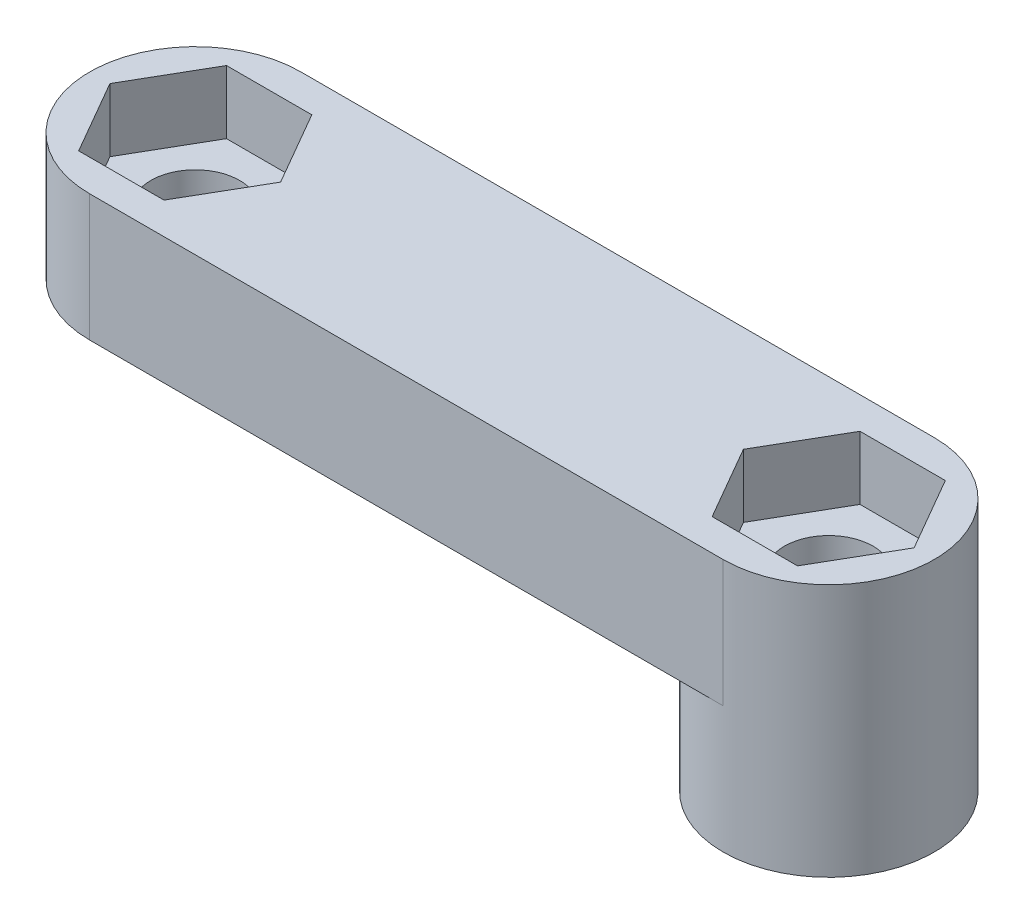
ISO-10303-21;
HEADER;
FILE_DESCRIPTION(('STEP AP214'),'2;1');
FILE_NAME('part.step','',(''),(''),'','','');
FILE_SCHEMA(('AUTOMOTIVE_DESIGN { 1 0 10303 214 1 1 1 1 }'));
ENDSEC;
DATA;
#1=APPLICATION_CONTEXT('core data for automotive mechanical design processes');
#2=APPLICATION_PROTOCOL_DEFINITION('international standard','automotive_design',2000,#1);
#3=PRODUCT_CONTEXT('',#1,'mechanical');
#4=PRODUCT('Part','Part','',(#3));
#5=PRODUCT_RELATED_PRODUCT_CATEGORY('part','',(#4));
#6=PRODUCT_DEFINITION_FORMATION('','',#4);
#7=PRODUCT_DEFINITION_CONTEXT('part definition',#1,'design');
#8=PRODUCT_DEFINITION('design','',#6,#7);
#9=PRODUCT_DEFINITION_SHAPE('','',#8);
#10=(LENGTH_UNIT() NAMED_UNIT(*) SI_UNIT(.MILLI.,.METRE.));
#11=(NAMED_UNIT(*) PLANE_ANGLE_UNIT() SI_UNIT($,.RADIAN.));
#12=(NAMED_UNIT(*) SI_UNIT($,.STERADIAN.) SOLID_ANGLE_UNIT());
#13=UNCERTAINTY_MEASURE_WITH_UNIT(LENGTH_MEASURE(1.E-05),#10,'distance_accuracy_value','');
#14=(GEOMETRIC_REPRESENTATION_CONTEXT(3) GLOBAL_UNCERTAINTY_ASSIGNED_CONTEXT((#13)) GLOBAL_UNIT_ASSIGNED_CONTEXT((#10,
#11,#12)) REPRESENTATION_CONTEXT('',''));
#15=CARTESIAN_POINT('',(0.,0.,0.));
#16=DIRECTION('',(0.,0.,1.));
#17=DIRECTION('',(1.,0.,0.));
#18=AXIS2_PLACEMENT_3D('',#15,#16,#17);
#19=CARTESIAN_POINT('',(15.,3.,0.));
#20=DIRECTION('',(0.,-1.,0.));
#21=DIRECTION('',(0.,0.,-1.));
#22=AXIS2_PLACEMENT_3D('',#19,#20,#21);
#23=CYLINDRICAL_SURFACE('',#22,2.1);
#24=CARTESIAN_POINT('',(15.,0.,0.));
#25=DIRECTION('',(0.,1.,0.));
#26=DIRECTION('',(0.,0.,1.));
#27=AXIS2_PLACEMENT_3D('',#24,#25,#26);
#28=CIRCLE('',#27,2.1);
#29=CARTESIAN_POINT('',(15.,0.,2.09999999999999));
#30=VERTEX_POINT('',#29);
#31=EDGE_CURVE('E47',#30,#30,#28,.T.);
#32=ORIENTED_EDGE('',*,*,#31,.T.);
#33=EDGE_LOOP('',(#32));
#34=FACE_BOUND('',#33,.T.);
#35=CARTESIAN_POINT('',(15.,-9.,0.));
#36=DIRECTION('',(0.,-1.,0.));
#37=DIRECTION('',(0.,0.,-1.));
#38=AXIS2_PLACEMENT_3D('',#35,#36,#37);
#39=CIRCLE('',#38,2.1);
#40=CARTESIAN_POINT('',(15.,-9.,-2.1));
#41=VERTEX_POINT('',#40);
#42=EDGE_CURVE('E473',#41,#41,#39,.T.);
#43=ORIENTED_EDGE('',*,*,#42,.T.);
#44=EDGE_LOOP('',(#43));
#45=FACE_BOUND('',#44,.T.);
#46=ADVANCED_FACE('F43',(#34,#45),#23,.F.);
#47=CARTESIAN_POINT('',(-15.,3.,0.));
#48=DIRECTION('',(0.,-1.,0.));
#49=DIRECTION('',(0.,0.,-1.));
#50=AXIS2_PLACEMENT_3D('',#47,#48,#49);
#51=CYLINDRICAL_SURFACE('',#50,2.1);
#52=CARTESIAN_POINT('',(-15.,-3.,0.));
#53=DIRECTION('',(0.,1.,0.));
#54=DIRECTION('',(0.,0.,1.));
#55=AXIS2_PLACEMENT_3D('',#52,#53,#54);
#56=CIRCLE('',#55,2.1);
#57=CARTESIAN_POINT('',(-15.,-3.,2.1));
#58=VERTEX_POINT('',#57);
#59=EDGE_CURVE('E204',#58,#58,#56,.T.);
#60=ORIENTED_EDGE('',*,*,#59,.F.);
#61=EDGE_LOOP('',(#60));
#62=FACE_BOUND('',#61,.T.);
#63=CARTESIAN_POINT('',(-15.,0.,0.));
#64=DIRECTION('',(0.,1.,0.));
#65=DIRECTION('',(0.,0.,1.));
#66=AXIS2_PLACEMENT_3D('',#63,#64,#65);
#67=CIRCLE('',#66,2.1);
#68=CARTESIAN_POINT('',(-15.,0.,2.1));
#69=VERTEX_POINT('',#68);
#70=EDGE_CURVE('E195',#69,#69,#67,.T.);
#71=ORIENTED_EDGE('',*,*,#70,.T.);
#72=EDGE_LOOP('',(#71));
#73=FACE_BOUND('',#72,.T.);
#74=ADVANCED_FACE('F323',(#62,#73),#51,.F.);
#75=CARTESIAN_POINT('',(-15.,3.,0.));
#76=DIRECTION('',(0.,1.,0.));
#77=DIRECTION('',(0.,0.,1.));
#78=AXIS2_PLACEMENT_3D('',#75,#76,#77);
#79=PLANE('',#78);
#80=DIRECTION('',(0.5,0.,-0.866025403784439));
#81=VECTOR('',#80,1.);
#82=CARTESIAN_POINT('',(-12.9792740578363,3.,3.5));
#83=LINE('',#82,#81);
#84=CARTESIAN_POINT('',(-12.9792740578363,3.,3.5));
#85=VERTEX_POINT('',#84);
#86=CARTESIAN_POINT('',(-10.9585481156726,3.,0.));
#87=VERTEX_POINT('',#86);
#88=EDGE_CURVE('E61',#85,#87,#83,.T.);
#89=ORIENTED_EDGE('',*,*,#88,.F.);
#90=DIRECTION('',(1.,0.,0.));
#91=VECTOR('',#90,1.);
#92=CARTESIAN_POINT('',(-17.0207259421637,3.,3.5));
#93=LINE('',#92,#91);
#94=CARTESIAN_POINT('',(-17.0207259421637,3.,3.5));
#95=VERTEX_POINT('',#94);
#96=EDGE_CURVE('E213',#95,#85,#93,.T.);
#97=ORIENTED_EDGE('',*,*,#96,.F.);
#98=DIRECTION('',(0.500000000000001,0.,0.866025403784438));
#99=VECTOR('',#98,1.);
#100=CARTESIAN_POINT('',(-19.0414518843274,3.,0.));
#101=LINE('',#100,#99);
#102=CARTESIAN_POINT('',(-19.0414518843274,3.,0.));
#103=VERTEX_POINT('',#102);
#104=EDGE_CURVE('E439',#103,#95,#101,.T.);
#105=ORIENTED_EDGE('',*,*,#104,.F.);
#106=DIRECTION('',(-0.5,0.,0.866025403784439));
#107=VECTOR('',#106,1.);
#108=CARTESIAN_POINT('',(-17.0207259421637,3.,-3.5));
#109=LINE('',#108,#107);
#110=CARTESIAN_POINT('',(-17.0207259421637,3.,-3.5));
#111=VERTEX_POINT('',#110);
#112=EDGE_CURVE('E432',#111,#103,#109,.T.);
#113=ORIENTED_EDGE('',*,*,#112,.F.);
#114=DIRECTION('',(-1.,0.,0.));
#115=VECTOR('',#114,1.);
#116=CARTESIAN_POINT('',(-12.9792740578363,3.,-3.5));
#117=LINE('',#116,#115);
#118=CARTESIAN_POINT('',(-12.9792740578363,3.,-3.5));
#119=VERTEX_POINT('',#118);
#120=EDGE_CURVE('E425',#119,#111,#117,.T.);
#121=ORIENTED_EDGE('',*,*,#120,.F.);
#122=DIRECTION('',(-0.5,0.,-0.866025403784439));
#123=VECTOR('',#122,1.);
#124=CARTESIAN_POINT('',(-10.9585481156726,3.,0.));
#125=LINE('',#124,#123);
#126=EDGE_CURVE('E433',#87,#119,#125,.T.);
#127=ORIENTED_EDGE('',*,*,#126,.F.);
#128=EDGE_LOOP('',(#89,#97,#105,#113,#121,#127));
#129=FACE_BOUND('',#128,.T.);
#130=DIRECTION('',(-0.5,0.,0.866025403784439));
#131=VECTOR('',#130,1.);
#132=CARTESIAN_POINT('',(12.9792740578363,3.,-3.50000000000001));
#133=LINE('',#132,#131);
#134=CARTESIAN_POINT('',(12.9792740578363,3.,-3.50000000000001));
#135=VERTEX_POINT('',#134);
#136=CARTESIAN_POINT('',(10.9585481156726,3.,0.));
#137=VERTEX_POINT('',#136);
#138=EDGE_CURVE('E69',#135,#137,#133,.T.);
#139=ORIENTED_EDGE('',*,*,#138,.F.);
#140=DIRECTION('',(-1.,0.,0.));
#141=VECTOR('',#140,1.);
#142=CARTESIAN_POINT('',(17.0207259421637,3.,-3.5));
#143=LINE('',#142,#141);
#144=CARTESIAN_POINT('',(17.0207259421637,3.,-3.5));
#145=VERTEX_POINT('',#144);
#146=EDGE_CURVE('E248',#145,#135,#143,.T.);
#147=ORIENTED_EDGE('',*,*,#146,.F.);
#148=DIRECTION('',(-0.499999999999999,0.,-0.866025403784439));
#149=VECTOR('',#148,1.);
#150=CARTESIAN_POINT('',(19.0414518843274,3.,0.));
#151=LINE('',#150,#149);
#152=CARTESIAN_POINT('',(19.0414518843274,3.,0.));
#153=VERTEX_POINT('',#152);
#154=EDGE_CURVE('E252',#153,#145,#151,.T.);
#155=ORIENTED_EDGE('',*,*,#154,.F.);
#156=DIRECTION('',(0.5,0.,-0.866025403784439));
#157=VECTOR('',#156,1.);
#158=CARTESIAN_POINT('',(17.0207259421637,3.,3.5));
#159=LINE('',#158,#157);
#160=CARTESIAN_POINT('',(17.0207259421637,3.,3.5));
#161=VERTEX_POINT('',#160);
#162=EDGE_CURVE('E257',#161,#153,#159,.T.);
#163=ORIENTED_EDGE('',*,*,#162,.F.);
#164=DIRECTION('',(1.,0.,0.));
#165=VECTOR('',#164,1.);
#166=CARTESIAN_POINT('',(12.9792740578363,3.,3.5));
#167=LINE('',#166,#165);
#168=CARTESIAN_POINT('',(12.9792740578363,3.,3.5));
#169=VERTEX_POINT('',#168);
#170=EDGE_CURVE('E261',#169,#161,#167,.T.);
#171=ORIENTED_EDGE('',*,*,#170,.F.);
#172=DIRECTION('',(0.499999999999999,0.,0.866025403784439));
#173=VECTOR('',#172,1.);
#174=CARTESIAN_POINT('',(10.9585481156726,3.,0.));
#175=LINE('',#174,#173);
#176=EDGE_CURVE('E265',#137,#169,#175,.T.);
#177=ORIENTED_EDGE('',*,*,#176,.F.);
#178=EDGE_LOOP('',(#139,#147,#155,#163,#171,#177));
#179=FACE_BOUND('',#178,.T.);
#180=CARTESIAN_POINT('',(-15.,3.,0.));
#181=DIRECTION('',(0.,1.,0.));
#182=DIRECTION('',(0.,0.,1.));
#183=AXIS2_PLACEMENT_3D('',#180,#181,#182);
#184=CIRCLE('',#183,5.);
#185=CARTESIAN_POINT('',(-15.,3.,-5.));
#186=VERTEX_POINT('',#185);
#187=CARTESIAN_POINT('',(-15.,3.,5.));
#188=VERTEX_POINT('',#187);
#189=EDGE_CURVE('E169',#186,#188,#184,.T.);
#190=ORIENTED_EDGE('',*,*,#189,.T.);
#191=DIRECTION('',(1.,0.,0.));
#192=VECTOR('',#191,1.);
#193=CARTESIAN_POINT('',(-15.,3.,5.));
#194=LINE('',#193,#192);
#195=CARTESIAN_POINT('',(15.,3.,4.99999999999999));
#196=VERTEX_POINT('',#195);
#197=EDGE_CURVE('E299',#188,#196,#194,.T.);
#198=ORIENTED_EDGE('',*,*,#197,.T.);
#199=CARTESIAN_POINT('',(15.,3.,0.));
#200=DIRECTION('',(0.,1.,0.));
#201=DIRECTION('',(0.,0.,1.));
#202=AXIS2_PLACEMENT_3D('',#199,#200,#201);
#203=CIRCLE('',#202,5.);
#204=CARTESIAN_POINT('',(15.,3.,-5.00000000000001));
#205=VERTEX_POINT('',#204);
#206=EDGE_CURVE('E187',#196,#205,#203,.T.);
#207=ORIENTED_EDGE('',*,*,#206,.T.);
#208=DIRECTION('',(-1.,0.,0.));
#209=VECTOR('',#208,1.);
#210=CARTESIAN_POINT('',(-15.,3.,-5.));
#211=LINE('',#210,#209);
#212=EDGE_CURVE('E176',#205,#186,#211,.T.);
#213=ORIENTED_EDGE('',*,*,#212,.T.);
#214=EDGE_LOOP('',(#190,#198,#207,#213));
#215=FACE_BOUND('',#214,.T.);
#216=ADVANCED_FACE('F314',(#129,#179,#215),#79,.T.);
#217=CARTESIAN_POINT('',(-15.,-3.,0.));
#218=DIRECTION('',(0.,1.,0.));
#219=DIRECTION('',(0.,0.,1.));
#220=AXIS2_PLACEMENT_3D('',#217,#218,#219);
#221=PLANE('',#220);
#222=CARTESIAN_POINT('',(15.,-3.,0.));
#223=DIRECTION('',(0.,-1.,0.));
#224=DIRECTION('',(0.,0.,-1.));
#225=AXIS2_PLACEMENT_3D('',#222,#223,#224);
#226=CIRCLE('',#225,5.);
#227=CARTESIAN_POINT('',(15.,-3.,4.99999999999999));
#228=VERTEX_POINT('',#227);
#229=CARTESIAN_POINT('',(15.,-3.,-5.00000000000001));
#230=VERTEX_POINT('',#229);
#231=EDGE_CURVE('E11',#228,#230,#226,.T.);
#232=ORIENTED_EDGE('',*,*,#231,.F.);
#233=DIRECTION('',(1.,0.,0.));
#234=VECTOR('',#233,1.);
#235=CARTESIAN_POINT('',(-15.,-3.,5.));
#236=LINE('',#235,#234);
#237=CARTESIAN_POINT('',(-15.,-3.,5.));
#238=VERTEX_POINT('',#237);
#239=EDGE_CURVE('E170',#238,#228,#236,.T.);
#240=ORIENTED_EDGE('',*,*,#239,.F.);
#241=CARTESIAN_POINT('',(-15.,-3.,0.));
#242=DIRECTION('',(0.,1.,0.));
#243=DIRECTION('',(0.,0.,1.));
#244=AXIS2_PLACEMENT_3D('',#241,#242,#243);
#245=CIRCLE('',#244,5.);
#246=CARTESIAN_POINT('',(-15.,-3.,-5.));
#247=VERTEX_POINT('',#246);
#248=EDGE_CURVE('E164',#247,#238,#245,.T.);
#249=ORIENTED_EDGE('',*,*,#248,.F.);
#250=DIRECTION('',(-1.,0.,0.));
#251=VECTOR('',#250,1.);
#252=CARTESIAN_POINT('',(-15.,-3.,-5.));
#253=LINE('',#252,#251);
#254=EDGE_CURVE('E158',#230,#247,#253,.T.);
#255=ORIENTED_EDGE('',*,*,#254,.F.);
#256=EDGE_LOOP('',(#232,#240,#249,#255));
#257=FACE_BOUND('',#256,.T.);
#258=ORIENTED_EDGE('',*,*,#59,.T.);
#259=EDGE_LOOP('',(#258));
#260=FACE_BOUND('',#259,.T.);
#261=ADVANCED_FACE('F160',(#257,#260),#221,.F.);
#262=CARTESIAN_POINT('',(-15.,3.,0.));
#263=DIRECTION('',(0.,-1.,0.));
#264=DIRECTION('',(0.,0.,-1.));
#265=AXIS2_PLACEMENT_3D('',#262,#263,#264);
#266=CYLINDRICAL_SURFACE('',#265,5.);
#267=ORIENTED_EDGE('',*,*,#248,.T.);
#268=DIRECTION('',(0.,-1.,0.));
#269=VECTOR('',#268,1.);
#270=CARTESIAN_POINT('',(-15.,3.,5.));
#271=LINE('',#270,#269);
#272=EDGE_CURVE('E53',#188,#238,#271,.T.);
#273=ORIENTED_EDGE('',*,*,#272,.F.);
#274=ORIENTED_EDGE('',*,*,#189,.F.);
#275=DIRECTION('',(0.,-1.,0.));
#276=VECTOR('',#275,1.);
#277=CARTESIAN_POINT('',(-15.,3.,-5.));
#278=LINE('',#277,#276);
#279=EDGE_CURVE('E181',#186,#247,#278,.T.);
#280=ORIENTED_EDGE('',*,*,#279,.T.);
#281=EDGE_LOOP('',(#267,#273,#274,#280));
#282=FACE_BOUND('',#281,.T.);
#283=ADVANCED_FACE('F45',(#282),#266,.T.);
#284=CARTESIAN_POINT('',(-15.,3.,5.));
#285=DIRECTION('',(0.,0.,-1.));
#286=DIRECTION('',(-1.,0.,0.));
#287=AXIS2_PLACEMENT_3D('',#284,#285,#286);
#288=PLANE('',#287);
#289=ORIENTED_EDGE('',*,*,#239,.T.);
#290=DIRECTION('',(0.,-1.,0.));
#291=VECTOR('',#290,1.);
#292=CARTESIAN_POINT('',(15.,3.,4.99999999999999));
#293=LINE('',#292,#291);
#294=EDGE_CURVE('E180',#196,#228,#293,.T.);
#295=ORIENTED_EDGE('',*,*,#294,.F.);
#296=ORIENTED_EDGE('',*,*,#197,.F.);
#297=ORIENTED_EDGE('',*,*,#272,.T.);
#298=EDGE_LOOP('',(#289,#295,#296,#297));
#299=FACE_BOUND('',#298,.T.);
#300=ADVANCED_FACE('F315',(#299),#288,.F.);
#301=CARTESIAN_POINT('',(15.,3.,0.));
#302=DIRECTION('',(0.,-1.,0.));
#303=DIRECTION('',(0.,0.,-1.));
#304=AXIS2_PLACEMENT_3D('',#301,#302,#303);
#305=CYLINDRICAL_SURFACE('',#304,5.);
#306=ORIENTED_EDGE('',*,*,#294,.T.);
#307=ORIENTED_EDGE('',*,*,#231,.T.);
#308=DIRECTION('',(0.,-1.,0.));
#309=VECTOR('',#308,1.);
#310=CARTESIAN_POINT('',(15.,3.,-5.00000000000001));
#311=LINE('',#310,#309);
#312=EDGE_CURVE('E174',#205,#230,#311,.T.);
#313=ORIENTED_EDGE('',*,*,#312,.F.);
#314=ORIENTED_EDGE('',*,*,#206,.F.);
#315=EDGE_LOOP('',(#306,#307,#313,#314));
#316=FACE_BOUND('',#315,.T.);
#317=CARTESIAN_POINT('',(15.,-9.,0.));
#318=DIRECTION('',(0.,-1.,0.));
#319=DIRECTION('',(0.,0.,-1.));
#320=AXIS2_PLACEMENT_3D('',#317,#318,#319);
#321=CIRCLE('',#320,5.);
#322=CARTESIAN_POINT('',(15.,-9.,-5.00000000000001));
#323=VERTEX_POINT('',#322);
#324=EDGE_CURVE('E247',#323,#323,#321,.T.);
#325=ORIENTED_EDGE('',*,*,#324,.F.);
#326=EDGE_LOOP('',(#325));
#327=FACE_BOUND('',#326,.T.);
#328=ADVANCED_FACE('F184',(#316,#327),#305,.T.);
#329=CARTESIAN_POINT('',(-15.,3.,-5.));
#330=DIRECTION('',(0.,0.,1.));
#331=DIRECTION('',(1.,0.,0.));
#332=AXIS2_PLACEMENT_3D('',#329,#330,#331);
#333=PLANE('',#332);
#334=ORIENTED_EDGE('',*,*,#254,.T.);
#335=ORIENTED_EDGE('',*,*,#279,.F.);
#336=ORIENTED_EDGE('',*,*,#212,.F.);
#337=ORIENTED_EDGE('',*,*,#312,.T.);
#338=EDGE_LOOP('',(#334,#335,#336,#337));
#339=FACE_BOUND('',#338,.T.);
#340=ADVANCED_FACE('F175',(#339),#333,.F.);
#341=CARTESIAN_POINT('',(-12.9792740578363,0.,3.5));
#342=DIRECTION('',(0.866025403784439,0.,0.5));
#343=DIRECTION('',(0.5,0.,-0.866025403784439));
#344=AXIS2_PLACEMENT_3D('',#341,#342,#343);
#345=PLANE('',#344);
#346=ORIENTED_EDGE('',*,*,#88,.T.);
#347=DIRECTION('',(0.,1.,0.));
#348=VECTOR('',#347,1.);
#349=CARTESIAN_POINT('',(-10.9585481156726,0.,0.));
#350=LINE('',#349,#348);
#351=CARTESIAN_POINT('',(-10.9585481156726,0.,0.));
#352=VERTEX_POINT('',#351);
#353=EDGE_CURVE('E224',#352,#87,#350,.T.);
#354=ORIENTED_EDGE('',*,*,#353,.F.);
#355=DIRECTION('',(0.5,0.,-0.866025403784439));
#356=VECTOR('',#355,1.);
#357=CARTESIAN_POINT('',(-12.9792740578363,0.,3.5));
#358=LINE('',#357,#356);
#359=CARTESIAN_POINT('',(-12.9792740578363,0.,3.5));
#360=VERTEX_POINT('',#359);
#361=EDGE_CURVE('E467',#360,#352,#358,.T.);
#362=ORIENTED_EDGE('',*,*,#361,.F.);
#363=DIRECTION('',(0.,1.,0.));
#364=VECTOR('',#363,1.);
#365=CARTESIAN_POINT('',(-12.9792740578363,0.,3.5));
#366=LINE('',#365,#364);
#367=EDGE_CURVE('E198',#360,#85,#366,.T.);
#368=ORIENTED_EDGE('',*,*,#367,.T.);
#369=EDGE_LOOP('',(#346,#354,#362,#368));
#370=FACE_BOUND('',#369,.T.);
#371=ADVANCED_FACE('F340',(#370),#345,.F.);
#372=CARTESIAN_POINT('',(-17.0207259421637,0.,3.5));
#373=DIRECTION('',(0.,0.,1.));
#374=DIRECTION('',(1.,0.,0.));
#375=AXIS2_PLACEMENT_3D('',#372,#373,#374);
#376=PLANE('',#375);
#377=ORIENTED_EDGE('',*,*,#96,.T.);
#378=ORIENTED_EDGE('',*,*,#367,.F.);
#379=DIRECTION('',(1.,0.,0.));
#380=VECTOR('',#379,1.);
#381=CARTESIAN_POINT('',(-17.0207259421637,0.,3.5));
#382=LINE('',#381,#380);
#383=CARTESIAN_POINT('',(-17.0207259421637,0.,3.5));
#384=VERTEX_POINT('',#383);
#385=EDGE_CURVE('E227',#384,#360,#382,.T.);
#386=ORIENTED_EDGE('',*,*,#385,.F.);
#387=DIRECTION('',(0.,1.,0.));
#388=VECTOR('',#387,1.);
#389=CARTESIAN_POINT('',(-17.0207259421637,0.,3.5));
#390=LINE('',#389,#388);
#391=EDGE_CURVE('E205',#384,#95,#390,.T.);
#392=ORIENTED_EDGE('',*,*,#391,.T.);
#393=EDGE_LOOP('',(#377,#378,#386,#392));
#394=FACE_BOUND('',#393,.T.);
#395=ADVANCED_FACE('F344',(#394),#376,.F.);
#396=CARTESIAN_POINT('',(-19.0414518843274,0.,0.));
#397=DIRECTION('',(-0.866025403784438,0.,0.500000000000001));
#398=DIRECTION('',(0.500000000000001,0.,0.866025403784438));
#399=AXIS2_PLACEMENT_3D('',#396,#397,#398);
#400=PLANE('',#399);
#401=ORIENTED_EDGE('',*,*,#104,.T.);
#402=ORIENTED_EDGE('',*,*,#391,.F.);
#403=DIRECTION('',(0.500000000000001,0.,0.866025403784438));
#404=VECTOR('',#403,1.);
#405=CARTESIAN_POINT('',(-19.0414518843274,0.,0.));
#406=LINE('',#405,#404);
#407=CARTESIAN_POINT('',(-19.0414518843274,0.,0.));
#408=VERTEX_POINT('',#407);
#409=EDGE_CURVE('E451',#408,#384,#406,.T.);
#410=ORIENTED_EDGE('',*,*,#409,.F.);
#411=DIRECTION('',(0.,1.,0.));
#412=VECTOR('',#411,1.);
#413=CARTESIAN_POINT('',(-19.0414518843274,0.,0.));
#414=LINE('',#413,#412);
#415=EDGE_CURVE('E210',#408,#103,#414,.T.);
#416=ORIENTED_EDGE('',*,*,#415,.T.);
#417=EDGE_LOOP('',(#401,#402,#410,#416));
#418=FACE_BOUND('',#417,.T.);
#419=ADVANCED_FACE('F349',(#418),#400,.F.);
#420=CARTESIAN_POINT('',(-17.0207259421637,0.,-3.5));
#421=DIRECTION('',(-0.866025403784439,0.,-0.5));
#422=DIRECTION('',(-0.5,0.,0.866025403784439));
#423=AXIS2_PLACEMENT_3D('',#420,#421,#422);
#424=PLANE('',#423);
#425=ORIENTED_EDGE('',*,*,#112,.T.);
#426=ORIENTED_EDGE('',*,*,#415,.F.);
#427=DIRECTION('',(-0.5,0.,0.866025403784439));
#428=VECTOR('',#427,1.);
#429=CARTESIAN_POINT('',(-17.0207259421637,0.,-3.5));
#430=LINE('',#429,#428);
#431=CARTESIAN_POINT('',(-17.0207259421637,0.,-3.5));
#432=VERTEX_POINT('',#431);
#433=EDGE_CURVE('E455',#432,#408,#430,.T.);
#434=ORIENTED_EDGE('',*,*,#433,.F.);
#435=DIRECTION('',(0.,1.,0.));
#436=VECTOR('',#435,1.);
#437=CARTESIAN_POINT('',(-17.0207259421637,0.,-3.5));
#438=LINE('',#437,#436);
#439=EDGE_CURVE('E218',#432,#111,#438,.T.);
#440=ORIENTED_EDGE('',*,*,#439,.T.);
#441=EDGE_LOOP('',(#425,#426,#434,#440));
#442=FACE_BOUND('',#441,.T.);
#443=ADVANCED_FACE('F412',(#442),#424,.F.);
#444=CARTESIAN_POINT('',(-12.9792740578363,0.,-3.5));
#445=DIRECTION('',(0.,0.,-1.));
#446=DIRECTION('',(-1.,0.,0.));
#447=AXIS2_PLACEMENT_3D('',#444,#445,#446);
#448=PLANE('',#447);
#449=ORIENTED_EDGE('',*,*,#120,.T.);
#450=ORIENTED_EDGE('',*,*,#439,.F.);
#451=DIRECTION('',(-1.,0.,0.));
#452=VECTOR('',#451,1.);
#453=CARTESIAN_POINT('',(-12.9792740578363,0.,-3.5));
#454=LINE('',#453,#452);
#455=CARTESIAN_POINT('',(-12.9792740578363,0.,-3.5));
#456=VERTEX_POINT('',#455);
#457=EDGE_CURVE('E459',#456,#432,#454,.T.);
#458=ORIENTED_EDGE('',*,*,#457,.F.);
#459=DIRECTION('',(0.,1.,0.));
#460=VECTOR('',#459,1.);
#461=CARTESIAN_POINT('',(-12.9792740578363,0.,-3.5));
#462=LINE('',#461,#460);
#463=EDGE_CURVE('E221',#456,#119,#462,.T.);
#464=ORIENTED_EDGE('',*,*,#463,.T.);
#465=EDGE_LOOP('',(#449,#450,#458,#464));
#466=FACE_BOUND('',#465,.T.);
#467=ADVANCED_FACE('F415',(#466),#448,.F.);
#468=CARTESIAN_POINT('',(-10.9585481156726,0.,0.));
#469=DIRECTION('',(0.866025403784439,0.,-0.5));
#470=DIRECTION('',(-0.5,0.,-0.866025403784439));
#471=AXIS2_PLACEMENT_3D('',#468,#469,#470);
#472=PLANE('',#471);
#473=ORIENTED_EDGE('',*,*,#126,.T.);
#474=ORIENTED_EDGE('',*,*,#463,.F.);
#475=DIRECTION('',(-0.5,0.,-0.866025403784439));
#476=VECTOR('',#475,1.);
#477=CARTESIAN_POINT('',(-10.9585481156726,0.,0.));
#478=LINE('',#477,#476);
#479=EDGE_CURVE('E463',#352,#456,#478,.T.);
#480=ORIENTED_EDGE('',*,*,#479,.F.);
#481=ORIENTED_EDGE('',*,*,#353,.T.);
#482=EDGE_LOOP('',(#473,#474,#480,#481));
#483=FACE_BOUND('',#482,.T.);
#484=ADVANCED_FACE('F354',(#483),#472,.F.);
#485=CARTESIAN_POINT('',(0.,0.,0.));
#486=DIRECTION('',(0.,1.,0.));
#487=DIRECTION('',(0.,0.,1.));
#488=AXIS2_PLACEMENT_3D('',#485,#486,#487);
#489=PLANE('',#488);
#490=ORIENTED_EDGE('',*,*,#70,.F.);
#491=EDGE_LOOP('',(#490));
#492=FACE_BOUND('',#491,.T.);
#493=ORIENTED_EDGE('',*,*,#361,.T.);
#494=ORIENTED_EDGE('',*,*,#479,.T.);
#495=ORIENTED_EDGE('',*,*,#457,.T.);
#496=ORIENTED_EDGE('',*,*,#433,.T.);
#497=ORIENTED_EDGE('',*,*,#409,.T.);
#498=ORIENTED_EDGE('',*,*,#385,.T.);
#499=EDGE_LOOP('',(#493,#494,#495,#496,#497,#498));
#500=FACE_BOUND('',#499,.T.);
#501=ADVANCED_FACE('F360',(#492,#500),#489,.T.);
#502=CARTESIAN_POINT('',(12.9792740578363,0.,-3.50000000000001));
#503=DIRECTION('',(-0.866025403784439,0.,-0.5));
#504=DIRECTION('',(-0.5,0.,0.866025403784439));
#505=AXIS2_PLACEMENT_3D('',#502,#503,#504);
#506=PLANE('',#505);
#507=ORIENTED_EDGE('',*,*,#138,.T.);
#508=DIRECTION('',(0.,1.,0.));
#509=VECTOR('',#508,1.);
#510=CARTESIAN_POINT('',(10.9585481156726,0.,0.));
#511=LINE('',#510,#509);
#512=CARTESIAN_POINT('',(10.9585481156726,0.,0.));
#513=VERTEX_POINT('',#512);
#514=EDGE_CURVE('E228',#513,#137,#511,.T.);
#515=ORIENTED_EDGE('',*,*,#514,.F.);
#516=DIRECTION('',(-0.5,0.,0.866025403784439));
#517=VECTOR('',#516,1.);
#518=CARTESIAN_POINT('',(12.9792740578363,0.,-3.50000000000001));
#519=LINE('',#518,#517);
#520=CARTESIAN_POINT('',(12.9792740578363,0.,-3.50000000000001));
#521=VERTEX_POINT('',#520);
#522=EDGE_CURVE('E253',#521,#513,#519,.T.);
#523=ORIENTED_EDGE('',*,*,#522,.F.);
#524=DIRECTION('',(0.,1.,0.));
#525=VECTOR('',#524,1.);
#526=CARTESIAN_POINT('',(12.9792740578363,0.,-3.50000000000001));
#527=LINE('',#526,#525);
#528=EDGE_CURVE('E244',#521,#135,#527,.T.);
#529=ORIENTED_EDGE('',*,*,#528,.T.);
#530=EDGE_LOOP('',(#507,#515,#523,#529));
#531=FACE_BOUND('',#530,.T.);
#532=ADVANCED_FACE('F356',(#531),#506,.F.);
#533=CARTESIAN_POINT('',(17.0207259421637,0.,-3.5));
#534=DIRECTION('',(0.,0.,-1.));
#535=DIRECTION('',(-1.,0.,0.));
#536=AXIS2_PLACEMENT_3D('',#533,#534,#535);
#537=PLANE('',#536);
#538=ORIENTED_EDGE('',*,*,#146,.T.);
#539=ORIENTED_EDGE('',*,*,#528,.F.);
#540=DIRECTION('',(-1.,0.,0.));
#541=VECTOR('',#540,1.);
#542=CARTESIAN_POINT('',(17.0207259421637,0.,-3.5));
#543=LINE('',#542,#541);
#544=CARTESIAN_POINT('',(17.0207259421637,0.,-3.5));
#545=VERTEX_POINT('',#544);
#546=EDGE_CURVE('E231',#545,#521,#543,.T.);
#547=ORIENTED_EDGE('',*,*,#546,.F.);
#548=DIRECTION('',(0.,1.,0.));
#549=VECTOR('',#548,1.);
#550=CARTESIAN_POINT('',(17.0207259421637,0.,-3.5));
#551=LINE('',#550,#549);
#552=EDGE_CURVE('E241',#545,#145,#551,.T.);
#553=ORIENTED_EDGE('',*,*,#552,.T.);
#554=EDGE_LOOP('',(#538,#539,#547,#553));
#555=FACE_BOUND('',#554,.T.);
#556=ADVANCED_FACE('F359',(#555),#537,.F.);
#557=CARTESIAN_POINT('',(19.0414518843274,0.,0.));
#558=DIRECTION('',(0.866025403784439,0.,-0.499999999999999));
#559=DIRECTION('',(-0.499999999999999,0.,-0.866025403784439));
#560=AXIS2_PLACEMENT_3D('',#557,#558,#559);
#561=PLANE('',#560);
#562=ORIENTED_EDGE('',*,*,#154,.T.);
#563=ORIENTED_EDGE('',*,*,#552,.F.);
#564=DIRECTION('',(-0.499999999999999,0.,-0.866025403784439));
#565=VECTOR('',#564,1.);
#566=CARTESIAN_POINT('',(19.0414518843274,0.,0.));
#567=LINE('',#566,#565);
#568=CARTESIAN_POINT('',(19.0414518843274,0.,0.));
#569=VERTEX_POINT('',#568);
#570=EDGE_CURVE('E274',#569,#545,#567,.T.);
#571=ORIENTED_EDGE('',*,*,#570,.F.);
#572=DIRECTION('',(0.,1.,0.));
#573=VECTOR('',#572,1.);
#574=CARTESIAN_POINT('',(19.0414518843274,0.,0.));
#575=LINE('',#574,#573);
#576=EDGE_CURVE('E238',#569,#153,#575,.T.);
#577=ORIENTED_EDGE('',*,*,#576,.T.);
#578=EDGE_LOOP('',(#562,#563,#571,#577));
#579=FACE_BOUND('',#578,.T.);
#580=ADVANCED_FACE('F373',(#579),#561,.F.);
#581=CARTESIAN_POINT('',(17.0207259421637,0.,3.5));
#582=DIRECTION('',(0.866025403784438,0.,0.5));
#583=DIRECTION('',(0.5,0.,-0.866025403784439));
#584=AXIS2_PLACEMENT_3D('',#581,#582,#583);
#585=PLANE('',#584);
#586=ORIENTED_EDGE('',*,*,#162,.T.);
#587=ORIENTED_EDGE('',*,*,#576,.F.);
#588=DIRECTION('',(0.5,0.,-0.866025403784439));
#589=VECTOR('',#588,1.);
#590=CARTESIAN_POINT('',(17.0207259421637,0.,3.5));
#591=LINE('',#590,#589);
#592=CARTESIAN_POINT('',(17.0207259421637,0.,3.5));
#593=VERTEX_POINT('',#592);
#594=EDGE_CURVE('E278',#593,#569,#591,.T.);
#595=ORIENTED_EDGE('',*,*,#594,.F.);
#596=DIRECTION('',(0.,1.,0.));
#597=VECTOR('',#596,1.);
#598=CARTESIAN_POINT('',(17.0207259421637,0.,3.5));
#599=LINE('',#598,#597);
#600=EDGE_CURVE('E235',#593,#161,#599,.T.);
#601=ORIENTED_EDGE('',*,*,#600,.T.);
#602=EDGE_LOOP('',(#586,#587,#595,#601));
#603=FACE_BOUND('',#602,.T.);
#604=ADVANCED_FACE('F369',(#603),#585,.F.);
#605=CARTESIAN_POINT('',(12.9792740578363,0.,3.5));
#606=DIRECTION('',(0.,0.,1.));
#607=DIRECTION('',(1.,0.,0.));
#608=AXIS2_PLACEMENT_3D('',#605,#606,#607);
#609=PLANE('',#608);
#610=ORIENTED_EDGE('',*,*,#170,.T.);
#611=ORIENTED_EDGE('',*,*,#600,.F.);
#612=DIRECTION('',(1.,0.,0.));
#613=VECTOR('',#612,1.);
#614=CARTESIAN_POINT('',(12.9792740578363,0.,3.5));
#615=LINE('',#614,#613);
#616=CARTESIAN_POINT('',(12.9792740578363,0.,3.5));
#617=VERTEX_POINT('',#616);
#618=EDGE_CURVE('E282',#617,#593,#615,.T.);
#619=ORIENTED_EDGE('',*,*,#618,.F.);
#620=DIRECTION('',(0.,1.,0.));
#621=VECTOR('',#620,1.);
#622=CARTESIAN_POINT('',(12.9792740578363,0.,3.5));
#623=LINE('',#622,#621);
#624=EDGE_CURVE('E232',#617,#169,#623,.T.);
#625=ORIENTED_EDGE('',*,*,#624,.T.);
#626=EDGE_LOOP('',(#610,#611,#619,#625));
#627=FACE_BOUND('',#626,.T.);
#628=ADVANCED_FACE('F365',(#627),#609,.F.);
#629=CARTESIAN_POINT('',(10.9585481156726,0.,0.));
#630=DIRECTION('',(-0.866025403784439,0.,0.499999999999999));
#631=DIRECTION('',(0.499999999999999,0.,0.866025403784439));
#632=AXIS2_PLACEMENT_3D('',#629,#630,#631);
#633=PLANE('',#632);
#634=ORIENTED_EDGE('',*,*,#176,.T.);
#635=ORIENTED_EDGE('',*,*,#624,.F.);
#636=DIRECTION('',(0.499999999999999,0.,0.866025403784439));
#637=VECTOR('',#636,1.);
#638=CARTESIAN_POINT('',(10.9585481156726,0.,0.));
#639=LINE('',#638,#637);
#640=EDGE_CURVE('E286',#513,#617,#639,.T.);
#641=ORIENTED_EDGE('',*,*,#640,.F.);
#642=ORIENTED_EDGE('',*,*,#514,.T.);
#643=EDGE_LOOP('',(#634,#635,#641,#642));
#644=FACE_BOUND('',#643,.T.);
#645=ADVANCED_FACE('F361',(#644),#633,.F.);
#646=CARTESIAN_POINT('',(0.,0.,0.));
#647=DIRECTION('',(0.,1.,0.));
#648=DIRECTION('',(0.,0.,1.));
#649=AXIS2_PLACEMENT_3D('',#646,#647,#648);
#650=PLANE('',#649);
#651=ORIENTED_EDGE('',*,*,#31,.F.);
#652=EDGE_LOOP('',(#651));
#653=FACE_BOUND('',#652,.T.);
#654=ORIENTED_EDGE('',*,*,#522,.T.);
#655=ORIENTED_EDGE('',*,*,#640,.T.);
#656=ORIENTED_EDGE('',*,*,#618,.T.);
#657=ORIENTED_EDGE('',*,*,#594,.T.);
#658=ORIENTED_EDGE('',*,*,#570,.T.);
#659=ORIENTED_EDGE('',*,*,#546,.T.);
#660=EDGE_LOOP('',(#654,#655,#656,#657,#658,#659));
#661=FACE_BOUND('',#660,.T.);
#662=ADVANCED_FACE('F364',(#653,#661),#650,.T.);
#663=CARTESIAN_POINT('',(15.,-9.,0.));
#664=DIRECTION('',(0.,-1.,0.));
#665=DIRECTION('',(0.,0.,-1.));
#666=AXIS2_PLACEMENT_3D('',#663,#664,#665);
#667=PLANE('',#666);
#668=ORIENTED_EDGE('',*,*,#324,.T.);
#669=EDGE_LOOP('',(#668));
#670=FACE_BOUND('',#669,.T.);
#671=ORIENTED_EDGE('',*,*,#42,.F.);
#672=EDGE_LOOP('',(#671));
#673=FACE_BOUND('',#672,.T.);
#674=ADVANCED_FACE('F381',(#670,#673),#667,.T.);
#675=CLOSED_SHELL('',(#46,#74,#216,#261,#283,#300,#328,#340,#371,#395,#419,#443,#467,#484,#501,
#532,#556,#580,#604,#628,#645,#662,#674));
#676=MANIFOLD_SOLID_BREP('B2',#675);
#677=ADVANCED_BREP_SHAPE_REPRESENTATION('',(#18,#676),#14);
#678=SHAPE_DEFINITION_REPRESENTATION(#9,#677);
ENDSEC;
END-ISO-10303-21;
